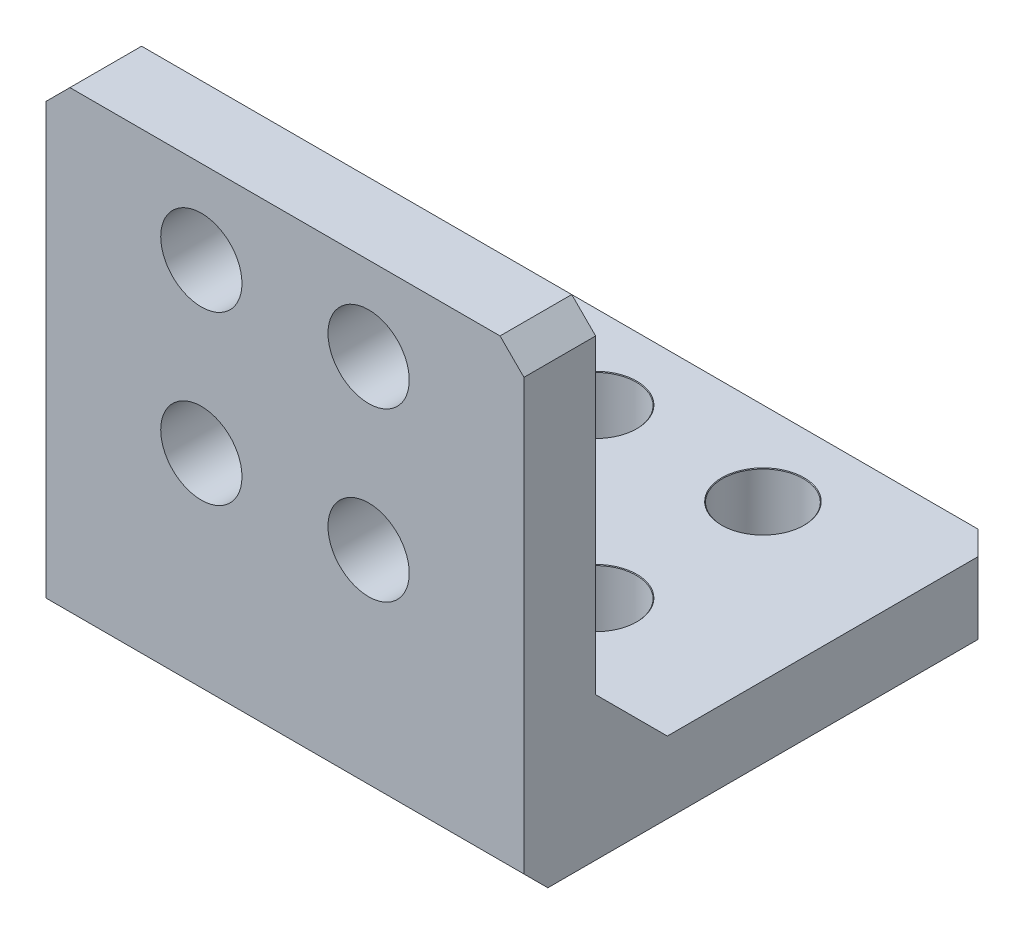
ISO-10303-21;
HEADER;
FILE_DESCRIPTION(('STEP AP214'),'2;1');
FILE_NAME('part.step','',(''),(''),'','','');
FILE_SCHEMA(('AUTOMOTIVE_DESIGN { 1 0 10303 214 1 1 1 1 }'));
ENDSEC;
DATA;
#1=APPLICATION_CONTEXT('core data for automotive mechanical design processes');
#2=APPLICATION_PROTOCOL_DEFINITION('international standard','automotive_design',2000,#1);
#3=PRODUCT_CONTEXT('',#1,'mechanical');
#4=PRODUCT('Part','Part','',(#3));
#5=PRODUCT_RELATED_PRODUCT_CATEGORY('part','',(#4));
#6=PRODUCT_DEFINITION_FORMATION('','',#4);
#7=PRODUCT_DEFINITION_CONTEXT('part definition',#1,'design');
#8=PRODUCT_DEFINITION('design','',#6,#7);
#9=PRODUCT_DEFINITION_SHAPE('','',#8);
#10=(LENGTH_UNIT() NAMED_UNIT(*) SI_UNIT(.MILLI.,.METRE.));
#11=(NAMED_UNIT(*) PLANE_ANGLE_UNIT() SI_UNIT($,.RADIAN.));
#12=(NAMED_UNIT(*) SI_UNIT($,.STERADIAN.) SOLID_ANGLE_UNIT());
#13=UNCERTAINTY_MEASURE_WITH_UNIT(LENGTH_MEASURE(1.E-05),#10,'distance_accuracy_value','');
#14=(GEOMETRIC_REPRESENTATION_CONTEXT(3) GLOBAL_UNCERTAINTY_ASSIGNED_CONTEXT((#13)) GLOBAL_UNIT_ASSIGNED_CONTEXT((#10,
#11,#12)) REPRESENTATION_CONTEXT('',''));
#15=CARTESIAN_POINT('',(0.,0.,0.));
#16=DIRECTION('',(0.,0.,1.));
#17=DIRECTION('',(1.,0.,0.));
#18=AXIS2_PLACEMENT_3D('',#15,#16,#17);
#19=CARTESIAN_POINT('',(20.,0.,7.));
#20=DIRECTION('',(0.,0.,1.));
#21=DIRECTION('',(1.,0.,0.));
#22=AXIS2_PLACEMENT_3D('',#19,#20,#21);
#23=PLANE('',#22);
#24=CARTESIAN_POINT('',(6.5,16.5,7.));
#25=DIRECTION('',(0.,0.,-1.));
#26=DIRECTION('',(-1.,0.,0.));
#27=AXIS2_PLACEMENT_3D('',#24,#25,#26);
#28=CIRCLE('',#27,1.725);
#29=CARTESIAN_POINT('',(4.775,16.5,7.));
#30=VERTEX_POINT('',#29);
#31=EDGE_CURVE('E358',#30,#30,#28,.T.);
#32=ORIENTED_EDGE('',*,*,#31,.F.);
#33=EDGE_LOOP('',(#32));
#34=FACE_BOUND('',#33,.T.);
#35=CARTESIAN_POINT('',(13.5,9.50000000000001,7.));
#36=DIRECTION('',(0.,0.,-1.));
#37=DIRECTION('',(-1.,0.,0.));
#38=AXIS2_PLACEMENT_3D('',#35,#36,#37);
#39=CIRCLE('',#38,1.725);
#40=CARTESIAN_POINT('',(11.775,9.50000000000001,7.));
#41=VERTEX_POINT('',#40);
#42=EDGE_CURVE('E244',#41,#41,#39,.T.);
#43=ORIENTED_EDGE('',*,*,#42,.F.);
#44=EDGE_LOOP('',(#43));
#45=FACE_BOUND('',#44,.T.);
#46=CARTESIAN_POINT('',(13.5,16.5,7.));
#47=DIRECTION('',(0.,0.,-1.));
#48=DIRECTION('',(-1.,0.,0.));
#49=AXIS2_PLACEMENT_3D('',#46,#47,#48);
#50=CIRCLE('',#49,1.725);
#51=CARTESIAN_POINT('',(11.775,16.5,7.));
#52=VERTEX_POINT('',#51);
#53=EDGE_CURVE('E238',#52,#52,#50,.T.);
#54=ORIENTED_EDGE('',*,*,#53,.F.);
#55=EDGE_LOOP('',(#54));
#56=FACE_BOUND('',#55,.T.);
#57=CARTESIAN_POINT('',(6.5,9.50000000000001,7.));
#58=DIRECTION('',(0.,0.,-1.));
#59=DIRECTION('',(-1.,0.,0.));
#60=AXIS2_PLACEMENT_3D('',#57,#58,#59);
#61=CIRCLE('',#60,1.725);
#62=CARTESIAN_POINT('',(4.775,9.50000000000001,7.));
#63=VERTEX_POINT('',#62);
#64=EDGE_CURVE('E232',#63,#63,#61,.T.);
#65=ORIENTED_EDGE('',*,*,#64,.F.);
#66=EDGE_LOOP('',(#65));
#67=FACE_BOUND('',#66,.T.);
#68=DIRECTION('',(0.,1.,0.));
#69=VECTOR('',#68,1.);
#70=CARTESIAN_POINT('',(0.,0.,7.));
#71=LINE('',#70,#69);
#72=CARTESIAN_POINT('',(0.,6.00000000000002,7.));
#73=VERTEX_POINT('',#72);
#74=CARTESIAN_POINT('',(0.,19.,7.));
#75=VERTEX_POINT('',#74);
#76=EDGE_CURVE('E154',#73,#75,#71,.T.);
#77=ORIENTED_EDGE('',*,*,#76,.T.);
#78=DIRECTION('',(-0.70710678118655,-0.707106781186545,0.));
#79=VECTOR('',#78,1.);
#80=CARTESIAN_POINT('',(0.,19.,7.));
#81=LINE('',#80,#79);
#82=CARTESIAN_POINT('',(1.,20.,7.));
#83=VERTEX_POINT('',#82);
#84=EDGE_CURVE('E289',#75,#83,#81,.F.);
#85=ORIENTED_EDGE('',*,*,#84,.T.);
#86=DIRECTION('',(-1.,0.,0.));
#87=VECTOR('',#86,1.);
#88=CARTESIAN_POINT('',(20.,20.,7.));
#89=LINE('',#88,#87);
#90=CARTESIAN_POINT('',(19.,20.,7.));
#91=VERTEX_POINT('',#90);
#92=EDGE_CURVE('E158',#91,#83,#89,.T.);
#93=ORIENTED_EDGE('',*,*,#92,.F.);
#94=DIRECTION('',(0.707106781186545,-0.70710678118655,0.));
#95=VECTOR('',#94,1.);
#96=CARTESIAN_POINT('',(19.,20.,7.));
#97=LINE('',#96,#95);
#98=CARTESIAN_POINT('',(20.,19.,7.));
#99=VERTEX_POINT('',#98);
#100=EDGE_CURVE('E286',#91,#99,#97,.T.);
#101=ORIENTED_EDGE('',*,*,#100,.T.);
#102=DIRECTION('',(0.,1.,0.));
#103=VECTOR('',#102,1.);
#104=CARTESIAN_POINT('',(20.,0.,7.));
#105=LINE('',#104,#103);
#106=CARTESIAN_POINT('',(20.,6.00000000000002,7.));
#107=VERTEX_POINT('',#106);
#108=EDGE_CURVE('E156',#107,#99,#105,.T.);
#109=ORIENTED_EDGE('',*,*,#108,.F.);
#110=DIRECTION('',(-1.,0.,0.));
#111=VECTOR('',#110,1.);
#112=CARTESIAN_POINT('',(0.,6.00000000000002,7.));
#113=LINE('',#112,#111);
#114=EDGE_CURVE('E142',#107,#73,#113,.T.);
#115=ORIENTED_EDGE('',*,*,#114,.T.);
#116=EDGE_LOOP('',(#77,#85,#93,#101,#109,#115));
#117=FACE_BOUND('',#116,.T.);
#118=ADVANCED_FACE('F46',(#34,#45,#56,#67,#117),#23,.F.);
#119=CARTESIAN_POINT('',(20.,20.,10.));
#120=DIRECTION('',(0.,1.,0.));
#121=DIRECTION('',(0.,0.,1.));
#122=AXIS2_PLACEMENT_3D('',#119,#120,#121);
#123=PLANE('',#122);
#124=ORIENTED_EDGE('',*,*,#92,.T.);
#125=DIRECTION('',(0.,0.,1.));
#126=VECTOR('',#125,1.);
#127=CARTESIAN_POINT('',(1.,20.,10.));
#128=LINE('',#127,#126);
#129=CARTESIAN_POINT('',(1.,20.,10.));
#130=VERTEX_POINT('',#129);
#131=EDGE_CURVE('E63',#83,#130,#128,.T.);
#132=ORIENTED_EDGE('',*,*,#131,.T.);
#133=DIRECTION('',(-1.,0.,0.));
#134=VECTOR('',#133,1.);
#135=CARTESIAN_POINT('',(20.,20.,10.));
#136=LINE('',#135,#134);
#137=CARTESIAN_POINT('',(19.,20.,10.));
#138=VERTEX_POINT('',#137);
#139=EDGE_CURVE('E194',#138,#130,#136,.T.);
#140=ORIENTED_EDGE('',*,*,#139,.F.);
#141=DIRECTION('',(0.,0.,-1.));
#142=VECTOR('',#141,1.);
#143=CARTESIAN_POINT('',(19.,20.,7.));
#144=LINE('',#143,#142);
#145=EDGE_CURVE('E292',#138,#91,#144,.T.);
#146=ORIENTED_EDGE('',*,*,#145,.T.);
#147=EDGE_LOOP('',(#124,#132,#140,#146));
#148=FACE_BOUND('',#147,.T.);
#149=ADVANCED_FACE('F367',(#148),#123,.T.);
#150=CARTESIAN_POINT('',(20.,0.,10.));
#151=DIRECTION('',(0.,0.,1.));
#152=DIRECTION('',(1.,0.,0.));
#153=AXIS2_PLACEMENT_3D('',#150,#151,#152);
#154=PLANE('',#153);
#155=CARTESIAN_POINT('',(6.5,16.5,10.));
#156=DIRECTION('',(0.,0.,1.));
#157=DIRECTION('',(1.,0.,0.));
#158=AXIS2_PLACEMENT_3D('',#155,#156,#157);
#159=CIRCLE('',#158,1.69999999999999);
#160=CARTESIAN_POINT('',(8.19999999999999,16.5,10.));
#161=VERTEX_POINT('',#160);
#162=EDGE_CURVE('E240',#161,#161,#159,.T.);
#163=ORIENTED_EDGE('',*,*,#162,.F.);
#164=EDGE_LOOP('',(#163));
#165=FACE_BOUND('',#164,.T.);
#166=CARTESIAN_POINT('',(13.5,9.50000000000001,10.));
#167=DIRECTION('',(0.,0.,1.));
#168=DIRECTION('',(1.,0.,0.));
#169=AXIS2_PLACEMENT_3D('',#166,#167,#168);
#170=CIRCLE('',#169,1.69999999999999);
#171=CARTESIAN_POINT('',(15.2,9.50000000000001,10.));
#172=VERTEX_POINT('',#171);
#173=EDGE_CURVE('E234',#172,#172,#170,.T.);
#174=ORIENTED_EDGE('',*,*,#173,.F.);
#175=EDGE_LOOP('',(#174));
#176=FACE_BOUND('',#175,.T.);
#177=CARTESIAN_POINT('',(13.5,16.5,10.));
#178=DIRECTION('',(0.,0.,1.));
#179=DIRECTION('',(1.,0.,0.));
#180=AXIS2_PLACEMENT_3D('',#177,#178,#179);
#181=CIRCLE('',#180,1.69999999999999);
#182=CARTESIAN_POINT('',(15.2,16.5,10.));
#183=VERTEX_POINT('',#182);
#184=EDGE_CURVE('E228',#183,#183,#181,.T.);
#185=ORIENTED_EDGE('',*,*,#184,.F.);
#186=EDGE_LOOP('',(#185));
#187=FACE_BOUND('',#186,.T.);
#188=CARTESIAN_POINT('',(6.5,9.50000000000001,10.));
#189=DIRECTION('',(0.,0.,1.));
#190=DIRECTION('',(1.,0.,0.));
#191=AXIS2_PLACEMENT_3D('',#188,#189,#190);
#192=CIRCLE('',#191,1.69999999999999);
#193=CARTESIAN_POINT('',(8.19999999999999,9.50000000000001,10.));
#194=VERTEX_POINT('',#193);
#195=EDGE_CURVE('E222',#194,#194,#192,.T.);
#196=ORIENTED_EDGE('',*,*,#195,.F.);
#197=EDGE_LOOP('',(#196));
#198=FACE_BOUND('',#197,.T.);
#199=ORIENTED_EDGE('',*,*,#139,.T.);
#200=DIRECTION('',(0.70710678118655,0.707106781186545,0.));
#201=VECTOR('',#200,1.);
#202=CARTESIAN_POINT('',(0.500000000000066,19.5000000000001,10.));
#203=LINE('',#202,#201);
#204=CARTESIAN_POINT('',(0.,19.,10.));
#205=VERTEX_POINT('',#204);
#206=EDGE_CURVE('E11',#130,#205,#203,.F.);
#207=ORIENTED_EDGE('',*,*,#206,.T.);
#208=DIRECTION('',(0.,1.,0.));
#209=VECTOR('',#208,1.);
#210=CARTESIAN_POINT('',(0.,0.,10.));
#211=LINE('',#210,#209);
#212=CARTESIAN_POINT('',(0.,1.,10.));
#213=VERTEX_POINT('',#212);
#214=EDGE_CURVE('E166',#213,#205,#211,.T.);
#215=ORIENTED_EDGE('',*,*,#214,.F.);
#216=DIRECTION('',(1.,0.,0.));
#217=VECTOR('',#216,1.);
#218=CARTESIAN_POINT('',(20.,1.,10.));
#219=LINE('',#218,#217);
#220=CARTESIAN_POINT('',(20.,1.,10.));
#221=VERTEX_POINT('',#220);
#222=EDGE_CURVE('E298',#213,#221,#219,.T.);
#223=ORIENTED_EDGE('',*,*,#222,.T.);
#224=DIRECTION('',(0.,1.,0.));
#225=VECTOR('',#224,1.);
#226=CARTESIAN_POINT('',(20.,0.,10.));
#227=LINE('',#226,#225);
#228=CARTESIAN_POINT('',(20.,19.,10.));
#229=VERTEX_POINT('',#228);
#230=EDGE_CURVE('E306',#221,#229,#227,.T.);
#231=ORIENTED_EDGE('',*,*,#230,.T.);
#232=DIRECTION('',(-0.707106781186545,0.70710678118655,0.));
#233=VECTOR('',#232,1.);
#234=CARTESIAN_POINT('',(29.5,9.49999999999993,10.));
#235=LINE('',#234,#233);
#236=EDGE_CURVE('E56',#229,#138,#235,.T.);
#237=ORIENTED_EDGE('',*,*,#236,.T.);
#238=EDGE_LOOP('',(#199,#207,#215,#223,#231,#237));
#239=FACE_BOUND('',#238,.T.);
#240=ADVANCED_FACE('F441',(#165,#176,#187,#198,#239),#154,.T.);
#241=CARTESIAN_POINT('',(20.,0.,10.));
#242=DIRECTION('',(0.,-1.,0.));
#243=DIRECTION('',(0.,0.,-1.));
#244=AXIS2_PLACEMENT_3D('',#241,#242,#243);
#245=PLANE('',#244);
#246=CARTESIAN_POINT('',(6.5,0.,-6.49999999999999));
#247=DIRECTION('',(0.,-1.,0.));
#248=DIRECTION('',(0.,0.,-1.));
#249=AXIS2_PLACEMENT_3D('',#246,#247,#248);
#250=CIRCLE('',#249,1.69999999999999);
#251=CARTESIAN_POINT('',(6.5,0.,-8.19999999999999));
#252=VERTEX_POINT('',#251);
#253=EDGE_CURVE('E216',#252,#252,#250,.T.);
#254=ORIENTED_EDGE('',*,*,#253,.F.);
#255=EDGE_LOOP('',(#254));
#256=FACE_BOUND('',#255,.T.);
#257=CARTESIAN_POINT('',(13.5,0.,-6.49999999999999));
#258=DIRECTION('',(0.,-1.,0.));
#259=DIRECTION('',(0.,0.,-1.));
#260=AXIS2_PLACEMENT_3D('',#257,#258,#259);
#261=CIRCLE('',#260,1.69999999999999);
#262=CARTESIAN_POINT('',(13.5,0.,-8.19999999999999));
#263=VERTEX_POINT('',#262);
#264=EDGE_CURVE('E210',#263,#263,#261,.T.);
#265=ORIENTED_EDGE('',*,*,#264,.F.);
#266=EDGE_LOOP('',(#265));
#267=FACE_BOUND('',#266,.T.);
#268=CARTESIAN_POINT('',(13.5,0.,0.500000000000007));
#269=DIRECTION('',(0.,-1.,0.));
#270=DIRECTION('',(0.,0.,-1.));
#271=AXIS2_PLACEMENT_3D('',#268,#269,#270);
#272=CIRCLE('',#271,1.69999999999999);
#273=CARTESIAN_POINT('',(13.5,0.,-1.19999999999999));
#274=VERTEX_POINT('',#273);
#275=EDGE_CURVE('E204',#274,#274,#272,.T.);
#276=ORIENTED_EDGE('',*,*,#275,.F.);
#277=EDGE_LOOP('',(#276));
#278=FACE_BOUND('',#277,.T.);
#279=CARTESIAN_POINT('',(6.5,0.,0.500000000000007));
#280=DIRECTION('',(0.,-1.,0.));
#281=DIRECTION('',(0.,0.,-1.));
#282=AXIS2_PLACEMENT_3D('',#279,#280,#281);
#283=CIRCLE('',#282,1.69999999999999);
#284=CARTESIAN_POINT('',(6.5,0.,-1.19999999999999));
#285=VERTEX_POINT('',#284);
#286=EDGE_CURVE('E167',#285,#285,#283,.T.);
#287=ORIENTED_EDGE('',*,*,#286,.F.);
#288=EDGE_LOOP('',(#287));
#289=FACE_BOUND('',#288,.T.);
#290=DIRECTION('',(0.,0.,1.));
#291=VECTOR('',#290,1.);
#292=CARTESIAN_POINT('',(0.,0.,10.));
#293=LINE('',#292,#291);
#294=CARTESIAN_POINT('',(0.,0.,-9.00000000000001));
#295=VERTEX_POINT('',#294);
#296=CARTESIAN_POINT('',(0.,0.,9.));
#297=VERTEX_POINT('',#296);
#298=EDGE_CURVE('E171',#295,#297,#293,.T.);
#299=ORIENTED_EDGE('',*,*,#298,.F.);
#300=DIRECTION('',(-0.707106781186549,0.,0.707106781186546));
#301=VECTOR('',#300,1.);
#302=CARTESIAN_POINT('',(0.500000000000049,0.,-9.50000000000006));
#303=LINE('',#302,#301);
#304=CARTESIAN_POINT('',(0.999999999999994,0.,-10.));
#305=VERTEX_POINT('',#304);
#306=EDGE_CURVE('E261',#295,#305,#303,.F.);
#307=ORIENTED_EDGE('',*,*,#306,.T.);
#308=DIRECTION('',(-1.,0.,0.));
#309=VECTOR('',#308,1.);
#310=CARTESIAN_POINT('',(20.,0.,-10.));
#311=LINE('',#310,#309);
#312=CARTESIAN_POINT('',(19.,0.,-10.));
#313=VERTEX_POINT('',#312);
#314=EDGE_CURVE('E190',#313,#305,#311,.T.);
#315=ORIENTED_EDGE('',*,*,#314,.F.);
#316=DIRECTION('',(0.707106781186546,0.,0.707106781186549));
#317=VECTOR('',#316,1.);
#318=CARTESIAN_POINT('',(29.5,0.,0.500000000000053));
#319=LINE('',#318,#317);
#320=CARTESIAN_POINT('',(20.,0.,-9.));
#321=VERTEX_POINT('',#320);
#322=EDGE_CURVE('E258',#313,#321,#319,.T.);
#323=ORIENTED_EDGE('',*,*,#322,.T.);
#324=DIRECTION('',(0.,0.,1.));
#325=VECTOR('',#324,1.);
#326=CARTESIAN_POINT('',(20.,0.,10.));
#327=LINE('',#326,#325);
#328=CARTESIAN_POINT('',(20.,0.,9.));
#329=VERTEX_POINT('',#328);
#330=EDGE_CURVE('E303',#321,#329,#327,.T.);
#331=ORIENTED_EDGE('',*,*,#330,.T.);
#332=DIRECTION('',(-1.,0.,0.));
#333=VECTOR('',#332,1.);
#334=CARTESIAN_POINT('',(20.,0.,9.));
#335=LINE('',#334,#333);
#336=EDGE_CURVE('E254',#329,#297,#335,.T.);
#337=ORIENTED_EDGE('',*,*,#336,.T.);
#338=EDGE_LOOP('',(#299,#307,#315,#323,#331,#337));
#339=FACE_BOUND('',#338,.T.);
#340=ADVANCED_FACE('F437',(#256,#267,#278,#289,#339),#245,.T.);
#341=CARTESIAN_POINT('',(20.,3.,-10.));
#342=DIRECTION('',(0.,0.,-1.));
#343=DIRECTION('',(0.,1.,0.));
#344=AXIS2_PLACEMENT_3D('',#341,#342,#343);
#345=PLANE('',#344);
#346=ORIENTED_EDGE('',*,*,#314,.T.);
#347=DIRECTION('',(0.,1.,0.));
#348=VECTOR('',#347,1.);
#349=CARTESIAN_POINT('',(0.999999999999994,3.,-10.));
#350=LINE('',#349,#348);
#351=CARTESIAN_POINT('',(0.999999999999994,3.,-10.));
#352=VERTEX_POINT('',#351);
#353=EDGE_CURVE('E268',#305,#352,#350,.T.);
#354=ORIENTED_EDGE('',*,*,#353,.T.);
#355=DIRECTION('',(-1.,0.,0.));
#356=VECTOR('',#355,1.);
#357=CARTESIAN_POINT('',(20.,3.,-10.));
#358=LINE('',#357,#356);
#359=CARTESIAN_POINT('',(19.,3.,-10.));
#360=VERTEX_POINT('',#359);
#361=EDGE_CURVE('E186',#360,#352,#358,.T.);
#362=ORIENTED_EDGE('',*,*,#361,.F.);
#363=DIRECTION('',(0.,-1.,0.));
#364=VECTOR('',#363,1.);
#365=CARTESIAN_POINT('',(19.,0.,-10.));
#366=LINE('',#365,#364);
#367=EDGE_CURVE('E264',#360,#313,#366,.T.);
#368=ORIENTED_EDGE('',*,*,#367,.T.);
#369=EDGE_LOOP('',(#346,#354,#362,#368));
#370=FACE_BOUND('',#369,.T.);
#371=ADVANCED_FACE('F433',(#370),#345,.T.);
#372=CARTESIAN_POINT('',(20.,3.,10.));
#373=DIRECTION('',(0.,-1.,0.));
#374=DIRECTION('',(0.,0.,-1.));
#375=AXIS2_PLACEMENT_3D('',#372,#373,#374);
#376=PLANE('',#375);
#377=CARTESIAN_POINT('',(6.5,3.,-6.49999999999999));
#378=DIRECTION('',(0.,1.,0.));
#379=DIRECTION('',(0.,0.,1.));
#380=AXIS2_PLACEMENT_3D('',#377,#378,#379);
#381=CIRCLE('',#380,1.725);
#382=CARTESIAN_POINT('',(6.5,3.,-4.77499999999999));
#383=VERTEX_POINT('',#382);
#384=EDGE_CURVE('E226',#383,#383,#381,.T.);
#385=ORIENTED_EDGE('',*,*,#384,.F.);
#386=EDGE_LOOP('',(#385));
#387=FACE_BOUND('',#386,.T.);
#388=CARTESIAN_POINT('',(13.5,3.,-6.49999999999999));
#389=DIRECTION('',(0.,1.,0.));
#390=DIRECTION('',(0.,0.,1.));
#391=AXIS2_PLACEMENT_3D('',#388,#389,#390);
#392=CIRCLE('',#391,1.725);
#393=CARTESIAN_POINT('',(13.5,3.,-4.77499999999999));
#394=VERTEX_POINT('',#393);
#395=EDGE_CURVE('E220',#394,#394,#392,.T.);
#396=ORIENTED_EDGE('',*,*,#395,.F.);
#397=EDGE_LOOP('',(#396));
#398=FACE_BOUND('',#397,.T.);
#399=CARTESIAN_POINT('',(13.5,3.,0.500000000000007));
#400=DIRECTION('',(0.,1.,0.));
#401=DIRECTION('',(0.,0.,1.));
#402=AXIS2_PLACEMENT_3D('',#399,#400,#401);
#403=CIRCLE('',#402,1.725);
#404=CARTESIAN_POINT('',(13.5,3.,2.22500000000001));
#405=VERTEX_POINT('',#404);
#406=EDGE_CURVE('E214',#405,#405,#403,.T.);
#407=ORIENTED_EDGE('',*,*,#406,.F.);
#408=EDGE_LOOP('',(#407));
#409=FACE_BOUND('',#408,.T.);
#410=CARTESIAN_POINT('',(6.5,3.,0.500000000000007));
#411=DIRECTION('',(0.,1.,0.));
#412=DIRECTION('',(0.,0.,1.));
#413=AXIS2_PLACEMENT_3D('',#410,#411,#412);
#414=CIRCLE('',#413,1.725);
#415=CARTESIAN_POINT('',(6.5,3.,2.22500000000001));
#416=VERTEX_POINT('',#415);
#417=EDGE_CURVE('E208',#416,#416,#414,.T.);
#418=ORIENTED_EDGE('',*,*,#417,.F.);
#419=EDGE_LOOP('',(#418));
#420=FACE_BOUND('',#419,.T.);
#421=ORIENTED_EDGE('',*,*,#361,.T.);
#422=DIRECTION('',(0.707106781186549,0.,-0.707106781186546));
#423=VECTOR('',#422,1.);
#424=CARTESIAN_POINT('',(0.,3.,-9.00000000000001));
#425=LINE('',#424,#423);
#426=CARTESIAN_POINT('',(0.,3.,-9.00000000000001));
#427=VERTEX_POINT('',#426);
#428=EDGE_CURVE('E274',#352,#427,#425,.F.);
#429=ORIENTED_EDGE('',*,*,#428,.T.);
#430=DIRECTION('',(0.,0.,1.));
#431=VECTOR('',#430,1.);
#432=CARTESIAN_POINT('',(0.,3.,10.));
#433=LINE('',#432,#431);
#434=CARTESIAN_POINT('',(0.,3.,4.00000000000001));
#435=VERTEX_POINT('',#434);
#436=EDGE_CURVE('E183',#427,#435,#433,.T.);
#437=ORIENTED_EDGE('',*,*,#436,.T.);
#438=DIRECTION('',(1.,0.,0.));
#439=VECTOR('',#438,1.);
#440=CARTESIAN_POINT('',(20.,3.,4.00000000000001));
#441=LINE('',#440,#439);
#442=CARTESIAN_POINT('',(20.,3.,4.00000000000001));
#443=VERTEX_POINT('',#442);
#444=EDGE_CURVE('E144',#435,#443,#441,.T.);
#445=ORIENTED_EDGE('',*,*,#444,.T.);
#446=DIRECTION('',(0.,0.,1.));
#447=VECTOR('',#446,1.);
#448=CARTESIAN_POINT('',(20.,3.,10.));
#449=LINE('',#448,#447);
#450=CARTESIAN_POINT('',(20.,3.,-9.));
#451=VERTEX_POINT('',#450);
#452=EDGE_CURVE('E177',#451,#443,#449,.T.);
#453=ORIENTED_EDGE('',*,*,#452,.F.);
#454=DIRECTION('',(-0.707106781186546,0.,-0.707106781186549));
#455=VECTOR('',#454,1.);
#456=CARTESIAN_POINT('',(19.,3.,-10.));
#457=LINE('',#456,#455);
#458=EDGE_CURVE('E271',#451,#360,#457,.T.);
#459=ORIENTED_EDGE('',*,*,#458,.T.);
#460=EDGE_LOOP('',(#421,#429,#437,#445,#453,#459));
#461=FACE_BOUND('',#460,.T.);
#462=ADVANCED_FACE('F428',(#387,#398,#409,#420,#461),#376,.F.);
#463=CARTESIAN_POINT('',(20.,0.,0.));
#464=DIRECTION('',(-1.,0.,0.));
#465=DIRECTION('',(0.,0.,1.));
#466=AXIS2_PLACEMENT_3D('',#463,#464,#465);
#467=PLANE('',#466);
#468=ORIENTED_EDGE('',*,*,#330,.F.);
#469=DIRECTION('',(0.,1.,0.));
#470=VECTOR('',#469,1.);
#471=CARTESIAN_POINT('',(20.,3.,-8.99999999999999));
#472=LINE('',#471,#470);
#473=EDGE_CURVE('E283',#321,#451,#472,.T.);
#474=ORIENTED_EDGE('',*,*,#473,.T.);
#475=ORIENTED_EDGE('',*,*,#452,.T.);
#476=DIRECTION('',(0.,-0.707106781186551,-0.707106781186544));
#477=VECTOR('',#476,1.);
#478=CARTESIAN_POINT('',(20.,-0.500000000000019,0.500000000000024));
#479=LINE('',#478,#477);
#480=EDGE_CURVE('E149',#443,#107,#479,.F.);
#481=ORIENTED_EDGE('',*,*,#480,.T.);
#482=ORIENTED_EDGE('',*,*,#108,.T.);
#483=DIRECTION('',(0.,0.,1.));
#484=VECTOR('',#483,1.);
#485=CARTESIAN_POINT('',(20.,19.,10.));
#486=LINE('',#485,#484);
#487=EDGE_CURVE('E280',#99,#229,#486,.T.);
#488=ORIENTED_EDGE('',*,*,#487,.T.);
#489=ORIENTED_EDGE('',*,*,#230,.F.);
#490=DIRECTION('',(0.,0.70710678118655,0.707106781186545));
#491=VECTOR('',#490,1.);
#492=CARTESIAN_POINT('',(20.,0.,9.));
#493=LINE('',#492,#491);
#494=EDGE_CURVE('E277',#221,#329,#493,.F.);
#495=ORIENTED_EDGE('',*,*,#494,.T.);
#496=EDGE_LOOP('',(#468,#474,#475,#481,#482,#488,#489,#495));
#497=FACE_BOUND('',#496,.T.);
#498=ADVANCED_FACE('F425',(#497),#467,.F.);
#499=CARTESIAN_POINT('',(0.,0.,0.));
#500=DIRECTION('',(-1.,0.,0.));
#501=DIRECTION('',(0.,0.,1.));
#502=AXIS2_PLACEMENT_3D('',#499,#500,#501);
#503=PLANE('',#502);
#504=ORIENTED_EDGE('',*,*,#436,.F.);
#505=DIRECTION('',(0.,-1.,0.));
#506=VECTOR('',#505,1.);
#507=CARTESIAN_POINT('',(0.,0.,-9.00000000000001));
#508=LINE('',#507,#506);
#509=EDGE_CURVE('E250',#427,#295,#508,.T.);
#510=ORIENTED_EDGE('',*,*,#509,.T.);
#511=ORIENTED_EDGE('',*,*,#298,.T.);
#512=DIRECTION('',(0.,-0.70710678118655,-0.707106781186545));
#513=VECTOR('',#512,1.);
#514=CARTESIAN_POINT('',(0.,-4.5,4.50000000000003));
#515=LINE('',#514,#513);
#516=EDGE_CURVE('E202',#297,#213,#515,.F.);
#517=ORIENTED_EDGE('',*,*,#516,.T.);
#518=ORIENTED_EDGE('',*,*,#214,.T.);
#519=DIRECTION('',(0.,0.,-1.));
#520=VECTOR('',#519,1.);
#521=CARTESIAN_POINT('',(0.,19.,0.));
#522=LINE('',#521,#520);
#523=EDGE_CURVE('E164',#205,#75,#522,.T.);
#524=ORIENTED_EDGE('',*,*,#523,.T.);
#525=ORIENTED_EDGE('',*,*,#76,.F.);
#526=DIRECTION('',(0.,0.707106781186551,0.707106781186544));
#527=VECTOR('',#526,1.);
#528=CARTESIAN_POINT('',(0.,6.00000000000002,7.));
#529=LINE('',#528,#527);
#530=EDGE_CURVE('E138',#73,#435,#529,.F.);
#531=ORIENTED_EDGE('',*,*,#530,.T.);
#532=EDGE_LOOP('',(#504,#510,#511,#517,#518,#524,#525,#531));
#533=FACE_BOUND('',#532,.T.);
#534=ADVANCED_FACE('F161',(#533),#503,.T.);
#535=CARTESIAN_POINT('',(20.,6.00000000000002,7.));
#536=DIRECTION('',(0.,0.707106781186544,-0.707106781186551));
#537=DIRECTION('',(1.,0.,0.));
#538=AXIS2_PLACEMENT_3D('',#535,#536,#537);
#539=PLANE('',#538);
#540=ORIENTED_EDGE('',*,*,#480,.F.);
#541=ORIENTED_EDGE('',*,*,#444,.F.);
#542=ORIENTED_EDGE('',*,*,#530,.F.);
#543=ORIENTED_EDGE('',*,*,#114,.F.);
#544=EDGE_LOOP('',(#540,#541,#542,#543));
#545=FACE_BOUND('',#544,.T.);
#546=ADVANCED_FACE('F141',(#545),#539,.T.);
#547=CARTESIAN_POINT('',(6.5,3.,0.500000000000007));
#548=DIRECTION('',(0.,1.,0.));
#549=DIRECTION('',(0.,0.,1.));
#550=AXIS2_PLACEMENT_3D('',#547,#548,#549);
#551=CYLINDRICAL_SURFACE('',#550,1.69999999999999);
#552=ORIENTED_EDGE('',*,*,#286,.T.);
#553=EDGE_LOOP('',(#552));
#554=FACE_BOUND('',#553,.T.);
#555=CARTESIAN_POINT('',(6.5,2.975,0.500000000000007));
#556=DIRECTION('',(0.,1.,0.));
#557=DIRECTION('',(0.,0.,1.));
#558=AXIS2_PLACEMENT_3D('',#555,#556,#557);
#559=CIRCLE('',#558,1.7);
#560=CARTESIAN_POINT('',(6.5,2.975,2.20000000000001));
#561=VERTEX_POINT('',#560);
#562=EDGE_CURVE('E174',#561,#561,#559,.T.);
#563=ORIENTED_EDGE('',*,*,#562,.T.);
#564=EDGE_LOOP('',(#563));
#565=FACE_BOUND('',#564,.T.);
#566=ADVANCED_FACE('F420',(#554,#565),#551,.F.);
#567=CARTESIAN_POINT('',(6.5,3.,0.500000000000007));
#568=DIRECTION('',(0.,1.,0.));
#569=DIRECTION('',(0.,0.,1.));
#570=AXIS2_PLACEMENT_3D('',#567,#568,#569);
#571=CONICAL_SURFACE('',#570,1.725,0.785398163397483);
#572=ORIENTED_EDGE('',*,*,#562,.F.);
#573=EDGE_LOOP('',(#572));
#574=FACE_BOUND('',#573,.T.);
#575=ORIENTED_EDGE('',*,*,#417,.T.);
#576=EDGE_LOOP('',(#575));
#577=FACE_BOUND('',#576,.T.);
#578=ADVANCED_FACE('F416',(#574,#577),#571,.F.);
#579=CARTESIAN_POINT('',(13.5,3.,0.500000000000007));
#580=DIRECTION('',(0.,1.,0.));
#581=DIRECTION('',(0.,0.,1.));
#582=AXIS2_PLACEMENT_3D('',#579,#580,#581);
#583=CYLINDRICAL_SURFACE('',#582,1.69999999999999);
#584=ORIENTED_EDGE('',*,*,#275,.T.);
#585=EDGE_LOOP('',(#584));
#586=FACE_BOUND('',#585,.T.);
#587=CARTESIAN_POINT('',(13.5,2.975,0.500000000000007));
#588=DIRECTION('',(0.,1.,0.));
#589=DIRECTION('',(0.,0.,1.));
#590=AXIS2_PLACEMENT_3D('',#587,#588,#589);
#591=CIRCLE('',#590,1.7);
#592=CARTESIAN_POINT('',(13.5,2.975,2.20000000000001));
#593=VERTEX_POINT('',#592);
#594=EDGE_CURVE('E209',#593,#593,#591,.T.);
#595=ORIENTED_EDGE('',*,*,#594,.T.);
#596=EDGE_LOOP('',(#595));
#597=FACE_BOUND('',#596,.T.);
#598=ADVANCED_FACE('F412',(#586,#597),#583,.F.);
#599=CARTESIAN_POINT('',(13.5,3.,0.500000000000007));
#600=DIRECTION('',(0.,1.,0.));
#601=DIRECTION('',(0.,0.,1.));
#602=AXIS2_PLACEMENT_3D('',#599,#600,#601);
#603=CONICAL_SURFACE('',#602,1.725,0.785398163397483);
#604=ORIENTED_EDGE('',*,*,#594,.F.);
#605=EDGE_LOOP('',(#604));
#606=FACE_BOUND('',#605,.T.);
#607=ORIENTED_EDGE('',*,*,#406,.T.);
#608=EDGE_LOOP('',(#607));
#609=FACE_BOUND('',#608,.T.);
#610=ADVANCED_FACE('F408',(#606,#609),#603,.F.);
#611=CARTESIAN_POINT('',(13.5,3.,-6.49999999999999));
#612=DIRECTION('',(0.,1.,0.));
#613=DIRECTION('',(0.,0.,1.));
#614=AXIS2_PLACEMENT_3D('',#611,#612,#613);
#615=CYLINDRICAL_SURFACE('',#614,1.69999999999999);
#616=ORIENTED_EDGE('',*,*,#264,.T.);
#617=EDGE_LOOP('',(#616));
#618=FACE_BOUND('',#617,.T.);
#619=CARTESIAN_POINT('',(13.5,2.975,-6.49999999999999));
#620=DIRECTION('',(0.,1.,0.));
#621=DIRECTION('',(0.,0.,1.));
#622=AXIS2_PLACEMENT_3D('',#619,#620,#621);
#623=CIRCLE('',#622,1.7);
#624=CARTESIAN_POINT('',(13.5,2.975,-4.79999999999999));
#625=VERTEX_POINT('',#624);
#626=EDGE_CURVE('E215',#625,#625,#623,.T.);
#627=ORIENTED_EDGE('',*,*,#626,.T.);
#628=EDGE_LOOP('',(#627));
#629=FACE_BOUND('',#628,.T.);
#630=ADVANCED_FACE('F404',(#618,#629),#615,.F.);
#631=CARTESIAN_POINT('',(13.5,3.,-6.49999999999999));
#632=DIRECTION('',(0.,1.,0.));
#633=DIRECTION('',(0.,0.,1.));
#634=AXIS2_PLACEMENT_3D('',#631,#632,#633);
#635=CONICAL_SURFACE('',#634,1.725,0.785398163397483);
#636=ORIENTED_EDGE('',*,*,#626,.F.);
#637=EDGE_LOOP('',(#636));
#638=FACE_BOUND('',#637,.T.);
#639=ORIENTED_EDGE('',*,*,#395,.T.);
#640=EDGE_LOOP('',(#639));
#641=FACE_BOUND('',#640,.T.);
#642=ADVANCED_FACE('F400',(#638,#641),#635,.F.);
#643=CARTESIAN_POINT('',(6.5,3.,-6.49999999999999));
#644=DIRECTION('',(0.,1.,0.));
#645=DIRECTION('',(0.,0.,1.));
#646=AXIS2_PLACEMENT_3D('',#643,#644,#645);
#647=CYLINDRICAL_SURFACE('',#646,1.69999999999999);
#648=ORIENTED_EDGE('',*,*,#253,.T.);
#649=EDGE_LOOP('',(#648));
#650=FACE_BOUND('',#649,.T.);
#651=CARTESIAN_POINT('',(6.5,2.975,-6.49999999999999));
#652=DIRECTION('',(0.,1.,0.));
#653=DIRECTION('',(0.,0.,1.));
#654=AXIS2_PLACEMENT_3D('',#651,#652,#653);
#655=CIRCLE('',#654,1.7);
#656=CARTESIAN_POINT('',(6.5,2.975,-4.79999999999999));
#657=VERTEX_POINT('',#656);
#658=EDGE_CURVE('E221',#657,#657,#655,.T.);
#659=ORIENTED_EDGE('',*,*,#658,.T.);
#660=EDGE_LOOP('',(#659));
#661=FACE_BOUND('',#660,.T.);
#662=ADVANCED_FACE('F396',(#650,#661),#647,.F.);
#663=CARTESIAN_POINT('',(6.5,3.,-6.49999999999999));
#664=DIRECTION('',(0.,1.,0.));
#665=DIRECTION('',(0.,0.,1.));
#666=AXIS2_PLACEMENT_3D('',#663,#664,#665);
#667=CONICAL_SURFACE('',#666,1.725,0.785398163397483);
#668=ORIENTED_EDGE('',*,*,#658,.F.);
#669=EDGE_LOOP('',(#668));
#670=FACE_BOUND('',#669,.T.);
#671=ORIENTED_EDGE('',*,*,#384,.T.);
#672=EDGE_LOOP('',(#671));
#673=FACE_BOUND('',#672,.T.);
#674=ADVANCED_FACE('F388',(#670,#673),#667,.F.);
#675=CARTESIAN_POINT('',(6.5,9.50000000000001,7.));
#676=DIRECTION('',(0.,0.,-1.));
#677=DIRECTION('',(-1.,0.,0.));
#678=AXIS2_PLACEMENT_3D('',#675,#676,#677);
#679=CYLINDRICAL_SURFACE('',#678,1.69999999999999);
#680=ORIENTED_EDGE('',*,*,#195,.T.);
#681=EDGE_LOOP('',(#680));
#682=FACE_BOUND('',#681,.T.);
#683=CARTESIAN_POINT('',(6.5,9.50000000000001,7.02500000000003));
#684=DIRECTION('',(0.,0.,-1.));
#685=DIRECTION('',(-1.,0.,0.));
#686=AXIS2_PLACEMENT_3D('',#683,#684,#685);
#687=CIRCLE('',#686,1.69999999999999);
#688=CARTESIAN_POINT('',(4.80000000000001,9.50000000000001,7.02500000000003));
#689=VERTEX_POINT('',#688);
#690=EDGE_CURVE('E227',#689,#689,#687,.T.);
#691=ORIENTED_EDGE('',*,*,#690,.T.);
#692=EDGE_LOOP('',(#691));
#693=FACE_BOUND('',#692,.T.);
#694=ADVANCED_FACE('F378',(#682,#693),#679,.F.);
#695=CARTESIAN_POINT('',(6.5,9.50000000000001,7.));
#696=DIRECTION('',(0.,0.,-1.));
#697=DIRECTION('',(-1.,0.,0.));
#698=AXIS2_PLACEMENT_3D('',#695,#696,#697);
#699=CONICAL_SURFACE('',#698,1.725,0.785398163397136);
#700=ORIENTED_EDGE('',*,*,#690,.F.);
#701=EDGE_LOOP('',(#700));
#702=FACE_BOUND('',#701,.T.);
#703=ORIENTED_EDGE('',*,*,#64,.T.);
#704=EDGE_LOOP('',(#703));
#705=FACE_BOUND('',#704,.T.);
#706=ADVANCED_FACE('F375',(#702,#705),#699,.F.);
#707=CARTESIAN_POINT('',(13.5,16.5,7.));
#708=DIRECTION('',(0.,0.,-1.));
#709=DIRECTION('',(-1.,0.,0.));
#710=AXIS2_PLACEMENT_3D('',#707,#708,#709);
#711=CYLINDRICAL_SURFACE('',#710,1.69999999999999);
#712=ORIENTED_EDGE('',*,*,#184,.T.);
#713=EDGE_LOOP('',(#712));
#714=FACE_BOUND('',#713,.T.);
#715=CARTESIAN_POINT('',(13.5,16.5,7.02500000000003));
#716=DIRECTION('',(0.,0.,-1.));
#717=DIRECTION('',(-1.,0.,0.));
#718=AXIS2_PLACEMENT_3D('',#715,#716,#717);
#719=CIRCLE('',#718,1.69999999999999);
#720=CARTESIAN_POINT('',(11.8,16.5,7.02500000000003));
#721=VERTEX_POINT('',#720);
#722=EDGE_CURVE('E233',#721,#721,#719,.T.);
#723=ORIENTED_EDGE('',*,*,#722,.T.);
#724=EDGE_LOOP('',(#723));
#725=FACE_BOUND('',#724,.T.);
#726=ADVANCED_FACE('F377',(#714,#725),#711,.F.);
#727=CARTESIAN_POINT('',(13.5,16.5,7.));
#728=DIRECTION('',(0.,0.,-1.));
#729=DIRECTION('',(-1.,0.,0.));
#730=AXIS2_PLACEMENT_3D('',#727,#728,#729);
#731=CONICAL_SURFACE('',#730,1.725,0.785398163397136);
#732=ORIENTED_EDGE('',*,*,#722,.F.);
#733=EDGE_LOOP('',(#732));
#734=FACE_BOUND('',#733,.T.);
#735=ORIENTED_EDGE('',*,*,#53,.T.);
#736=EDGE_LOOP('',(#735));
#737=FACE_BOUND('',#736,.T.);
#738=ADVANCED_FACE('F385',(#734,#737),#731,.F.);
#739=CARTESIAN_POINT('',(13.5,9.50000000000001,7.));
#740=DIRECTION('',(0.,0.,-1.));
#741=DIRECTION('',(-1.,0.,0.));
#742=AXIS2_PLACEMENT_3D('',#739,#740,#741);
#743=CYLINDRICAL_SURFACE('',#742,1.69999999999999);
#744=ORIENTED_EDGE('',*,*,#173,.T.);
#745=EDGE_LOOP('',(#744));
#746=FACE_BOUND('',#745,.T.);
#747=CARTESIAN_POINT('',(13.5,9.50000000000001,7.02500000000003));
#748=DIRECTION('',(0.,0.,-1.));
#749=DIRECTION('',(-1.,0.,0.));
#750=AXIS2_PLACEMENT_3D('',#747,#748,#749);
#751=CIRCLE('',#750,1.69999999999999);
#752=CARTESIAN_POINT('',(11.8,9.50000000000001,7.02500000000003));
#753=VERTEX_POINT('',#752);
#754=EDGE_CURVE('E239',#753,#753,#751,.T.);
#755=ORIENTED_EDGE('',*,*,#754,.T.);
#756=EDGE_LOOP('',(#755));
#757=FACE_BOUND('',#756,.T.);
#758=ADVANCED_FACE('F558',(#746,#757),#743,.F.);
#759=CARTESIAN_POINT('',(13.5,9.50000000000001,7.));
#760=DIRECTION('',(0.,0.,-1.));
#761=DIRECTION('',(-1.,0.,0.));
#762=AXIS2_PLACEMENT_3D('',#759,#760,#761);
#763=CONICAL_SURFACE('',#762,1.725,0.785398163397136);
#764=ORIENTED_EDGE('',*,*,#754,.F.);
#765=EDGE_LOOP('',(#764));
#766=FACE_BOUND('',#765,.T.);
#767=ORIENTED_EDGE('',*,*,#42,.T.);
#768=EDGE_LOOP('',(#767));
#769=FACE_BOUND('',#768,.T.);
#770=ADVANCED_FACE('F548',(#766,#769),#763,.F.);
#771=CARTESIAN_POINT('',(6.5,16.5,7.));
#772=DIRECTION('',(0.,0.,-1.));
#773=DIRECTION('',(-1.,0.,0.));
#774=AXIS2_PLACEMENT_3D('',#771,#772,#773);
#775=CYLINDRICAL_SURFACE('',#774,1.69999999999999);
#776=ORIENTED_EDGE('',*,*,#162,.T.);
#777=EDGE_LOOP('',(#776));
#778=FACE_BOUND('',#777,.T.);
#779=CARTESIAN_POINT('',(6.5,16.5,7.02500000000003));
#780=DIRECTION('',(0.,0.,-1.));
#781=DIRECTION('',(-1.,0.,0.));
#782=AXIS2_PLACEMENT_3D('',#779,#780,#781);
#783=CIRCLE('',#782,1.69999999999999);
#784=CARTESIAN_POINT('',(4.80000000000001,16.5,7.02500000000003));
#785=VERTEX_POINT('',#784);
#786=EDGE_CURVE('E245',#785,#785,#783,.T.);
#787=ORIENTED_EDGE('',*,*,#786,.T.);
#788=EDGE_LOOP('',(#787));
#789=FACE_BOUND('',#788,.T.);
#790=ADVANCED_FACE('F538',(#778,#789),#775,.F.);
#791=CARTESIAN_POINT('',(6.5,16.5,7.));
#792=DIRECTION('',(0.,0.,-1.));
#793=DIRECTION('',(-1.,0.,0.));
#794=AXIS2_PLACEMENT_3D('',#791,#792,#793);
#795=CONICAL_SURFACE('',#794,1.725,0.785398163397136);
#796=ORIENTED_EDGE('',*,*,#786,.F.);
#797=EDGE_LOOP('',(#796));
#798=FACE_BOUND('',#797,.T.);
#799=ORIENTED_EDGE('',*,*,#31,.T.);
#800=EDGE_LOOP('',(#799));
#801=FACE_BOUND('',#800,.T.);
#802=ADVANCED_FACE('F363',(#798,#801),#795,.F.);
#803=CARTESIAN_POINT('',(0.,0.,-9.00000000000001));
#804=DIRECTION('',(0.707106781186546,0.,0.707106781186549));
#805=DIRECTION('',(0.,-1.,0.));
#806=AXIS2_PLACEMENT_3D('',#803,#804,#805);
#807=PLANE('',#806);
#808=ORIENTED_EDGE('',*,*,#428,.F.);
#809=ORIENTED_EDGE('',*,*,#353,.F.);
#810=ORIENTED_EDGE('',*,*,#306,.F.);
#811=ORIENTED_EDGE('',*,*,#509,.F.);
#812=EDGE_LOOP('',(#808,#809,#810,#811));
#813=FACE_BOUND('',#812,.T.);
#814=ADVANCED_FACE('F454',(#813),#807,.F.);
#815=CARTESIAN_POINT('',(19.,3.,-10.));
#816=DIRECTION('',(0.707106781186549,0.,-0.707106781186546));
#817=DIRECTION('',(0.,1.,0.));
#818=AXIS2_PLACEMENT_3D('',#815,#816,#817);
#819=PLANE('',#818);
#820=ORIENTED_EDGE('',*,*,#458,.F.);
#821=ORIENTED_EDGE('',*,*,#473,.F.);
#822=ORIENTED_EDGE('',*,*,#322,.F.);
#823=ORIENTED_EDGE('',*,*,#367,.F.);
#824=EDGE_LOOP('',(#820,#821,#822,#823));
#825=FACE_BOUND('',#824,.T.);
#826=ADVANCED_FACE('F460',(#825),#819,.T.);
#827=CARTESIAN_POINT('',(0.,19.,0.));
#828=DIRECTION('',(0.707106781186545,-0.70710678118655,0.));
#829=DIRECTION('',(0.,0.,-1.));
#830=AXIS2_PLACEMENT_3D('',#827,#828,#829);
#831=PLANE('',#830);
#832=ORIENTED_EDGE('',*,*,#206,.F.);
#833=ORIENTED_EDGE('',*,*,#131,.F.);
#834=ORIENTED_EDGE('',*,*,#84,.F.);
#835=ORIENTED_EDGE('',*,*,#523,.F.);
#836=EDGE_LOOP('',(#832,#833,#834,#835));
#837=FACE_BOUND('',#836,.T.);
#838=ADVANCED_FACE('F467',(#837),#831,.F.);
#839=CARTESIAN_POINT('',(19.,20.,10.));
#840=DIRECTION('',(0.70710678118655,0.707106781186545,0.));
#841=DIRECTION('',(0.,0.,1.));
#842=AXIS2_PLACEMENT_3D('',#839,#840,#841);
#843=PLANE('',#842);
#844=ORIENTED_EDGE('',*,*,#236,.F.);
#845=ORIENTED_EDGE('',*,*,#487,.F.);
#846=ORIENTED_EDGE('',*,*,#100,.F.);
#847=ORIENTED_EDGE('',*,*,#145,.F.);
#848=EDGE_LOOP('',(#844,#845,#846,#847));
#849=FACE_BOUND('',#848,.T.);
#850=ADVANCED_FACE('F473',(#849),#843,.T.);
#851=CARTESIAN_POINT('',(20.,0.,9.));
#852=DIRECTION('',(0.,0.707106781186545,-0.70710678118655));
#853=DIRECTION('',(-1.,0.,0.));
#854=AXIS2_PLACEMENT_3D('',#851,#852,#853);
#855=PLANE('',#854);
#856=ORIENTED_EDGE('',*,*,#494,.F.);
#857=ORIENTED_EDGE('',*,*,#222,.F.);
#858=ORIENTED_EDGE('',*,*,#516,.F.);
#859=ORIENTED_EDGE('',*,*,#336,.F.);
#860=EDGE_LOOP('',(#856,#857,#858,#859));
#861=FACE_BOUND('',#860,.T.);
#862=ADVANCED_FACE('F49',(#861),#855,.F.);
#863=CLOSED_SHELL('',(#118,#149,#240,#340,#371,#462,#498,#534,#546,#566,#578,#598,#610,#630,
#642,#662,#674,#694,#706,#726,#738,#758,#770,#790,#802,#814,#826,#838,#850,#862));
#864=MANIFOLD_SOLID_BREP('B2',#863);
#865=ADVANCED_BREP_SHAPE_REPRESENTATION('',(#18,#864),#14);
#866=SHAPE_DEFINITION_REPRESENTATION(#9,#865);
ENDSEC;
END-ISO-10303-21;
